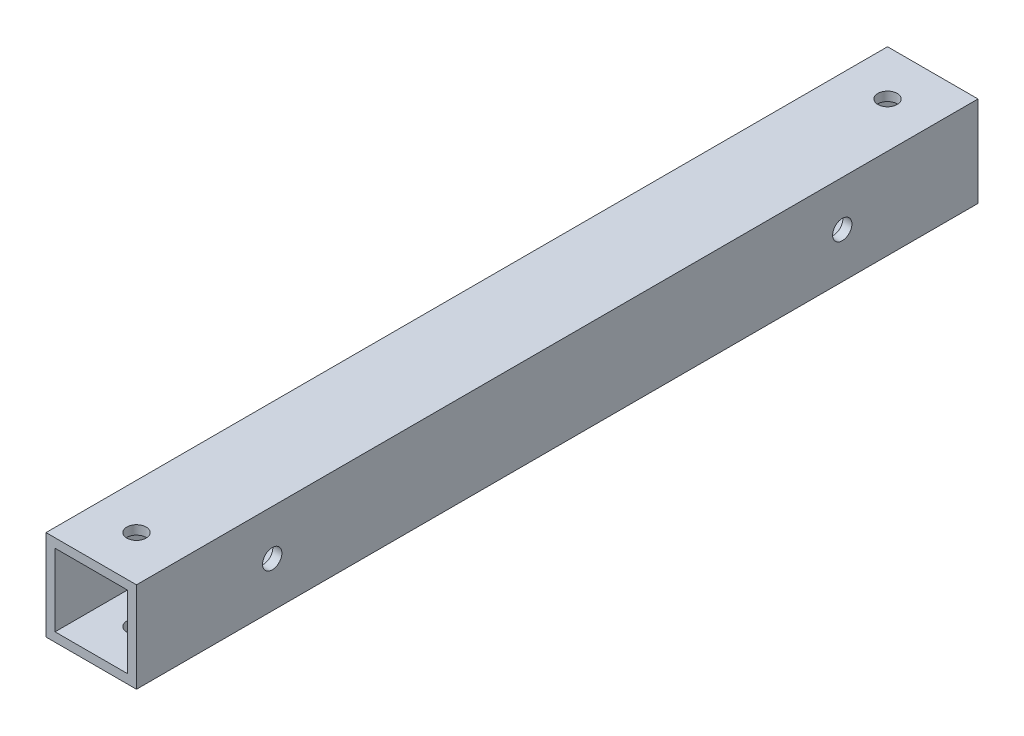
ISO-10303-21;
HEADER;
FILE_DESCRIPTION(('STEP AP214'),'2;1');
FILE_NAME('part.step','',(''),(''),'','','');
FILE_SCHEMA(('AUTOMOTIVE_DESIGN { 1 0 10303 214 1 1 1 1 }'));
ENDSEC;
DATA;
#1=APPLICATION_CONTEXT('core data for automotive mechanical design processes');
#2=APPLICATION_PROTOCOL_DEFINITION('international standard','automotive_design',2000,#1);
#3=PRODUCT_CONTEXT('',#1,'mechanical');
#4=PRODUCT('Part','Part','',(#3));
#5=PRODUCT_RELATED_PRODUCT_CATEGORY('part','',(#4));
#6=PRODUCT_DEFINITION_FORMATION('','',#4);
#7=PRODUCT_DEFINITION_CONTEXT('part definition',#1,'design');
#8=PRODUCT_DEFINITION('design','',#6,#7);
#9=PRODUCT_DEFINITION_SHAPE('','',#8);
#10=(LENGTH_UNIT() NAMED_UNIT(*) SI_UNIT(.MILLI.,.METRE.));
#11=(NAMED_UNIT(*) PLANE_ANGLE_UNIT() SI_UNIT($,.RADIAN.));
#12=(NAMED_UNIT(*) SI_UNIT($,.STERADIAN.) SOLID_ANGLE_UNIT());
#13=UNCERTAINTY_MEASURE_WITH_UNIT(LENGTH_MEASURE(1.E-05),#10,'distance_accuracy_value','');
#14=(GEOMETRIC_REPRESENTATION_CONTEXT(3) GLOBAL_UNCERTAINTY_ASSIGNED_CONTEXT((#13)) GLOBAL_UNIT_ASSIGNED_CONTEXT((#10,
#11,#12)) REPRESENTATION_CONTEXT('',''));
#15=CARTESIAN_POINT('',(0.,0.,0.));
#16=DIRECTION('',(0.,0.,1.));
#17=DIRECTION('',(1.,0.,0.));
#18=AXIS2_PLACEMENT_3D('',#15,#16,#17);
#19=CARTESIAN_POINT('',(0.,0.,139.5));
#20=DIRECTION('',(0.,0.,-1.));
#21=DIRECTION('',(-1.,0.,0.));
#22=AXIS2_PLACEMENT_3D('',#19,#20,#21);
#23=PLANE('',#22);
#24=DIRECTION('',(0.,1.,0.));
#25=VECTOR('',#24,1.);
#26=CARTESIAN_POINT('',(7.5,-7.5,139.5));
#27=LINE('',#26,#25);
#28=CARTESIAN_POINT('',(7.5,-7.5,139.5));
#29=VERTEX_POINT('',#28);
#30=CARTESIAN_POINT('',(7.5,7.5,139.5));
#31=VERTEX_POINT('',#30);
#32=EDGE_CURVE('E157',#29,#31,#27,.T.);
#33=ORIENTED_EDGE('',*,*,#32,.T.);
#34=DIRECTION('',(-1.,0.,0.));
#35=VECTOR('',#34,1.);
#36=CARTESIAN_POINT('',(-7.5,7.5,139.5));
#37=LINE('',#36,#35);
#38=CARTESIAN_POINT('',(-7.5,7.5,139.5));
#39=VERTEX_POINT('',#38);
#40=EDGE_CURVE('E161',#31,#39,#37,.T.);
#41=ORIENTED_EDGE('',*,*,#40,.T.);
#42=DIRECTION('',(0.,-1.,0.));
#43=VECTOR('',#42,1.);
#44=CARTESIAN_POINT('',(-7.5,-7.5,139.5));
#45=LINE('',#44,#43);
#46=CARTESIAN_POINT('',(-7.5,-7.5,139.5));
#47=VERTEX_POINT('',#46);
#48=EDGE_CURVE('E165',#39,#47,#45,.T.);
#49=ORIENTED_EDGE('',*,*,#48,.T.);
#50=DIRECTION('',(1.,0.,0.));
#51=VECTOR('',#50,1.);
#52=CARTESIAN_POINT('',(-7.5,-7.5,139.5));
#53=LINE('',#52,#51);
#54=EDGE_CURVE('E168',#47,#29,#53,.T.);
#55=ORIENTED_EDGE('',*,*,#54,.T.);
#56=EDGE_LOOP('',(#33,#41,#49,#55));
#57=FACE_BOUND('',#56,.T.);
#58=DIRECTION('',(0.,-1.,0.));
#59=VECTOR('',#58,1.);
#60=CARTESIAN_POINT('',(-6.,-6.,139.5));
#61=LINE('',#60,#59);
#62=CARTESIAN_POINT('',(-6.,6.,139.5));
#63=VERTEX_POINT('',#62);
#64=CARTESIAN_POINT('',(-6.,-6.,139.5));
#65=VERTEX_POINT('',#64);
#66=EDGE_CURVE('E107',#63,#65,#61,.T.);
#67=ORIENTED_EDGE('',*,*,#66,.F.);
#68=DIRECTION('',(-1.,0.,0.));
#69=VECTOR('',#68,1.);
#70=CARTESIAN_POINT('',(-6.,6.,139.5));
#71=LINE('',#70,#69);
#72=CARTESIAN_POINT('',(6.,6.,139.5));
#73=VERTEX_POINT('',#72);
#74=EDGE_CURVE('E133',#73,#63,#71,.T.);
#75=ORIENTED_EDGE('',*,*,#74,.F.);
#76=DIRECTION('',(0.,1.,0.));
#77=VECTOR('',#76,1.);
#78=CARTESIAN_POINT('',(6.,-6.,139.5));
#79=LINE('',#78,#77);
#80=CARTESIAN_POINT('',(6.,-6.,139.5));
#81=VERTEX_POINT('',#80);
#82=EDGE_CURVE('E129',#81,#73,#79,.T.);
#83=ORIENTED_EDGE('',*,*,#82,.F.);
#84=DIRECTION('',(1.,0.,0.));
#85=VECTOR('',#84,1.);
#86=CARTESIAN_POINT('',(-6.,-6.,139.5));
#87=LINE('',#86,#85);
#88=EDGE_CURVE('E116',#65,#81,#87,.T.);
#89=ORIENTED_EDGE('',*,*,#88,.F.);
#90=EDGE_LOOP('',(#67,#75,#83,#89));
#91=FACE_BOUND('',#90,.T.);
#92=ADVANCED_FACE('F39',(#57,#91),#23,.F.);
#93=CARTESIAN_POINT('',(0.,0.,0.));
#94=DIRECTION('',(0.,0.,-1.));
#95=DIRECTION('',(-1.,0.,0.));
#96=AXIS2_PLACEMENT_3D('',#93,#94,#95);
#97=PLANE('',#96);
#98=DIRECTION('',(0.,1.,0.));
#99=VECTOR('',#98,1.);
#100=CARTESIAN_POINT('',(7.5,-7.5,0.));
#101=LINE('',#100,#99);
#102=CARTESIAN_POINT('',(7.5,-7.5,0.));
#103=VERTEX_POINT('',#102);
#104=CARTESIAN_POINT('',(7.5,7.5,0.));
#105=VERTEX_POINT('',#104);
#106=EDGE_CURVE('E125',#103,#105,#101,.T.);
#107=ORIENTED_EDGE('',*,*,#106,.F.);
#108=DIRECTION('',(1.,0.,0.));
#109=VECTOR('',#108,1.);
#110=CARTESIAN_POINT('',(-7.5,-7.5,0.));
#111=LINE('',#110,#109);
#112=CARTESIAN_POINT('',(-7.5,-7.5,0.));
#113=VERTEX_POINT('',#112);
#114=EDGE_CURVE('E162',#113,#103,#111,.T.);
#115=ORIENTED_EDGE('',*,*,#114,.F.);
#116=DIRECTION('',(0.,-1.,0.));
#117=VECTOR('',#116,1.);
#118=CARTESIAN_POINT('',(-7.5,-7.5,0.));
#119=LINE('',#118,#117);
#120=CARTESIAN_POINT('',(-7.5,7.5,0.));
#121=VERTEX_POINT('',#120);
#122=EDGE_CURVE('E178',#121,#113,#119,.T.);
#123=ORIENTED_EDGE('',*,*,#122,.F.);
#124=DIRECTION('',(-1.,0.,0.));
#125=VECTOR('',#124,1.);
#126=CARTESIAN_POINT('',(-7.5,7.5,0.));
#127=LINE('',#126,#125);
#128=EDGE_CURVE('E175',#105,#121,#127,.T.);
#129=ORIENTED_EDGE('',*,*,#128,.F.);
#130=EDGE_LOOP('',(#107,#115,#123,#129));
#131=FACE_BOUND('',#130,.T.);
#132=DIRECTION('',(-1.,0.,0.));
#133=VECTOR('',#132,1.);
#134=CARTESIAN_POINT('',(-6.,6.,0.));
#135=LINE('',#134,#133);
#136=CARTESIAN_POINT('',(6.,6.,0.));
#137=VERTEX_POINT('',#136);
#138=CARTESIAN_POINT('',(-6.,6.,0.));
#139=VERTEX_POINT('',#138);
#140=EDGE_CURVE('E117',#137,#139,#135,.T.);
#141=ORIENTED_EDGE('',*,*,#140,.T.);
#142=DIRECTION('',(0.,-1.,0.));
#143=VECTOR('',#142,1.);
#144=CARTESIAN_POINT('',(-6.,-6.,0.));
#145=LINE('',#144,#143);
#146=CARTESIAN_POINT('',(-6.,-6.,0.));
#147=VERTEX_POINT('',#146);
#148=EDGE_CURVE('E65',#139,#147,#145,.T.);
#149=ORIENTED_EDGE('',*,*,#148,.T.);
#150=DIRECTION('',(1.,0.,0.));
#151=VECTOR('',#150,1.);
#152=CARTESIAN_POINT('',(-6.,-6.,0.));
#153=LINE('',#152,#151);
#154=CARTESIAN_POINT('',(6.,-6.,0.));
#155=VERTEX_POINT('',#154);
#156=EDGE_CURVE('E123',#147,#155,#153,.T.);
#157=ORIENTED_EDGE('',*,*,#156,.T.);
#158=DIRECTION('',(0.,1.,0.));
#159=VECTOR('',#158,1.);
#160=CARTESIAN_POINT('',(6.,-6.,0.));
#161=LINE('',#160,#159);
#162=EDGE_CURVE('E144',#155,#137,#161,.T.);
#163=ORIENTED_EDGE('',*,*,#162,.T.);
#164=EDGE_LOOP('',(#141,#149,#157,#163));
#165=FACE_BOUND('',#164,.T.);
#166=ADVANCED_FACE('F288',(#131,#165),#97,.T.);
#167=CARTESIAN_POINT('',(7.5,-7.5,139.5));
#168=DIRECTION('',(-1.,0.,0.));
#169=DIRECTION('',(0.,0.,1.));
#170=AXIS2_PLACEMENT_3D('',#167,#168,#169);
#171=PLANE('',#170);
#172=CARTESIAN_POINT('',(7.5,0.,117.));
#173=DIRECTION('',(1.,0.,0.));
#174=DIRECTION('',(0.,0.,-1.));
#175=AXIS2_PLACEMENT_3D('',#172,#173,#174);
#176=CIRCLE('',#175,1.60000000000002);
#177=CARTESIAN_POINT('',(7.5,0.,115.4));
#178=VERTEX_POINT('',#177);
#179=EDGE_CURVE('E214',#178,#178,#176,.T.);
#180=ORIENTED_EDGE('',*,*,#179,.F.);
#181=EDGE_LOOP('',(#180));
#182=FACE_BOUND('',#181,.T.);
#183=CARTESIAN_POINT('',(7.5,0.,22.5));
#184=DIRECTION('',(1.,0.,0.));
#185=DIRECTION('',(0.,0.,-1.));
#186=AXIS2_PLACEMENT_3D('',#183,#184,#185);
#187=CIRCLE('',#186,1.6);
#188=CARTESIAN_POINT('',(7.5,0.,20.9));
#189=VERTEX_POINT('',#188);
#190=EDGE_CURVE('E226',#189,#189,#187,.T.);
#191=ORIENTED_EDGE('',*,*,#190,.F.);
#192=EDGE_LOOP('',(#191));
#193=FACE_BOUND('',#192,.T.);
#194=ORIENTED_EDGE('',*,*,#106,.T.);
#195=DIRECTION('',(0.,0.,-1.));
#196=VECTOR('',#195,1.);
#197=CARTESIAN_POINT('',(7.5,7.5,139.5));
#198=LINE('',#197,#196);
#199=EDGE_CURVE('E11',#31,#105,#198,.T.);
#200=ORIENTED_EDGE('',*,*,#199,.F.);
#201=ORIENTED_EDGE('',*,*,#32,.F.);
#202=DIRECTION('',(0.,0.,-1.));
#203=VECTOR('',#202,1.);
#204=CARTESIAN_POINT('',(7.5,-7.5,139.5));
#205=LINE('',#204,#203);
#206=EDGE_CURVE('E171',#29,#103,#205,.T.);
#207=ORIENTED_EDGE('',*,*,#206,.T.);
#208=EDGE_LOOP('',(#194,#200,#201,#207));
#209=FACE_BOUND('',#208,.T.);
#210=ADVANCED_FACE('F41',(#182,#193,#209),#171,.F.);
#211=CARTESIAN_POINT('',(-7.5,7.5,139.5));
#212=DIRECTION('',(0.,-1.,0.));
#213=DIRECTION('',(0.,0.,-1.));
#214=AXIS2_PLACEMENT_3D('',#211,#212,#213);
#215=PLANE('',#214);
#216=CARTESIAN_POINT('',(0.,7.5,7.5));
#217=DIRECTION('',(0.,1.,0.));
#218=DIRECTION('',(0.,0.,1.));
#219=AXIS2_PLACEMENT_3D('',#216,#217,#218);
#220=CIRCLE('',#219,1.6);
#221=CARTESIAN_POINT('',(0.,7.5,9.1));
#222=VERTEX_POINT('',#221);
#223=EDGE_CURVE('E238',#222,#222,#220,.T.);
#224=ORIENTED_EDGE('',*,*,#223,.F.);
#225=EDGE_LOOP('',(#224));
#226=FACE_BOUND('',#225,.T.);
#227=CARTESIAN_POINT('',(0.,7.5,132.));
#228=DIRECTION('',(0.,1.,0.));
#229=DIRECTION('',(0.,0.,1.));
#230=AXIS2_PLACEMENT_3D('',#227,#228,#229);
#231=CIRCLE('',#230,1.59999999999999);
#232=CARTESIAN_POINT('',(0.,7.5,133.6));
#233=VERTEX_POINT('',#232);
#234=EDGE_CURVE('E234',#233,#233,#231,.T.);
#235=ORIENTED_EDGE('',*,*,#234,.F.);
#236=EDGE_LOOP('',(#235));
#237=FACE_BOUND('',#236,.T.);
#238=ORIENTED_EDGE('',*,*,#128,.T.);
#239=DIRECTION('',(0.,0.,-1.));
#240=VECTOR('',#239,1.);
#241=CARTESIAN_POINT('',(-7.5,7.5,139.5));
#242=LINE('',#241,#240);
#243=EDGE_CURVE('E49',#39,#121,#242,.T.);
#244=ORIENTED_EDGE('',*,*,#243,.F.);
#245=ORIENTED_EDGE('',*,*,#40,.F.);
#246=ORIENTED_EDGE('',*,*,#199,.T.);
#247=EDGE_LOOP('',(#238,#244,#245,#246));
#248=FACE_BOUND('',#247,.T.);
#249=ADVANCED_FACE('F292',(#226,#237,#248),#215,.F.);
#250=CARTESIAN_POINT('',(-7.5,-7.5,139.5));
#251=DIRECTION('',(1.,0.,0.));
#252=DIRECTION('',(0.,0.,-1.));
#253=AXIS2_PLACEMENT_3D('',#250,#251,#252);
#254=PLANE('',#253);
#255=CARTESIAN_POINT('',(-7.5,0.,117.));
#256=DIRECTION('',(1.,0.,0.));
#257=DIRECTION('',(0.,0.,-1.));
#258=AXIS2_PLACEMENT_3D('',#255,#256,#257);
#259=CIRCLE('',#258,1.60000000000002);
#260=CARTESIAN_POINT('',(-7.5,0.,115.4));
#261=VERTEX_POINT('',#260);
#262=EDGE_CURVE('E206',#261,#261,#259,.T.);
#263=ORIENTED_EDGE('',*,*,#262,.T.);
#264=EDGE_LOOP('',(#263));
#265=FACE_BOUND('',#264,.T.);
#266=CARTESIAN_POINT('',(-7.5,0.,22.5));
#267=DIRECTION('',(1.,0.,0.));
#268=DIRECTION('',(0.,0.,-1.));
#269=AXIS2_PLACEMENT_3D('',#266,#267,#268);
#270=CIRCLE('',#269,1.6);
#271=CARTESIAN_POINT('',(-7.5,0.,20.9));
#272=VERTEX_POINT('',#271);
#273=EDGE_CURVE('E220',#272,#272,#270,.T.);
#274=ORIENTED_EDGE('',*,*,#273,.T.);
#275=EDGE_LOOP('',(#274));
#276=FACE_BOUND('',#275,.T.);
#277=ORIENTED_EDGE('',*,*,#122,.T.);
#278=DIRECTION('',(0.,0.,-1.));
#279=VECTOR('',#278,1.);
#280=CARTESIAN_POINT('',(-7.5,-7.5,139.5));
#281=LINE('',#280,#279);
#282=EDGE_CURVE('E186',#47,#113,#281,.T.);
#283=ORIENTED_EDGE('',*,*,#282,.F.);
#284=ORIENTED_EDGE('',*,*,#48,.F.);
#285=ORIENTED_EDGE('',*,*,#243,.T.);
#286=EDGE_LOOP('',(#277,#283,#284,#285));
#287=FACE_BOUND('',#286,.T.);
#288=ADVANCED_FACE('F275',(#265,#276,#287),#254,.F.);
#289=CARTESIAN_POINT('',(-7.5,-7.5,139.5));
#290=DIRECTION('',(0.,1.,0.));
#291=DIRECTION('',(0.,0.,1.));
#292=AXIS2_PLACEMENT_3D('',#289,#290,#291);
#293=PLANE('',#292);
#294=CARTESIAN_POINT('',(0.,-7.5,7.5));
#295=DIRECTION('',(0.,1.,0.));
#296=DIRECTION('',(0.,0.,1.));
#297=AXIS2_PLACEMENT_3D('',#294,#295,#296);
#298=CIRCLE('',#297,1.6);
#299=CARTESIAN_POINT('',(0.,-7.5,9.1));
#300=VERTEX_POINT('',#299);
#301=EDGE_CURVE('E198',#300,#300,#298,.T.);
#302=ORIENTED_EDGE('',*,*,#301,.T.);
#303=EDGE_LOOP('',(#302));
#304=FACE_BOUND('',#303,.T.);
#305=CARTESIAN_POINT('',(0.,-7.5,132.));
#306=DIRECTION('',(0.,1.,0.));
#307=DIRECTION('',(0.,0.,1.));
#308=AXIS2_PLACEMENT_3D('',#305,#306,#307);
#309=CIRCLE('',#308,1.59999999999999);
#310=CARTESIAN_POINT('',(0.,-7.5,133.6));
#311=VERTEX_POINT('',#310);
#312=EDGE_CURVE('E242',#311,#311,#309,.T.);
#313=ORIENTED_EDGE('',*,*,#312,.T.);
#314=EDGE_LOOP('',(#313));
#315=FACE_BOUND('',#314,.T.);
#316=ORIENTED_EDGE('',*,*,#114,.T.);
#317=ORIENTED_EDGE('',*,*,#206,.F.);
#318=ORIENTED_EDGE('',*,*,#54,.F.);
#319=ORIENTED_EDGE('',*,*,#282,.T.);
#320=EDGE_LOOP('',(#316,#317,#318,#319));
#321=FACE_BOUND('',#320,.T.);
#322=ADVANCED_FACE('F272',(#304,#315,#321),#293,.F.);
#323=CARTESIAN_POINT('',(-6.,-6.,139.5));
#324=DIRECTION('',(1.,0.,0.));
#325=DIRECTION('',(0.,0.,-1.));
#326=AXIS2_PLACEMENT_3D('',#323,#324,#325);
#327=PLANE('',#326);
#328=CARTESIAN_POINT('',(-6.,0.,117.));
#329=DIRECTION('',(1.,0.,0.));
#330=DIRECTION('',(0.,0.,-1.));
#331=AXIS2_PLACEMENT_3D('',#328,#329,#330);
#332=CIRCLE('',#331,1.60000000000002);
#333=CARTESIAN_POINT('',(-6.,0.,115.4));
#334=VERTEX_POINT('',#333);
#335=EDGE_CURVE('E230',#334,#334,#332,.T.);
#336=ORIENTED_EDGE('',*,*,#335,.F.);
#337=EDGE_LOOP('',(#336));
#338=FACE_BOUND('',#337,.T.);
#339=CARTESIAN_POINT('',(-6.,0.,22.5));
#340=DIRECTION('',(1.,0.,0.));
#341=DIRECTION('',(0.,0.,-1.));
#342=AXIS2_PLACEMENT_3D('',#339,#340,#341);
#343=CIRCLE('',#342,1.6);
#344=CARTESIAN_POINT('',(-6.,0.,20.9));
#345=VERTEX_POINT('',#344);
#346=EDGE_CURVE('E205',#345,#345,#343,.T.);
#347=ORIENTED_EDGE('',*,*,#346,.F.);
#348=EDGE_LOOP('',(#347));
#349=FACE_BOUND('',#348,.T.);
#350=ORIENTED_EDGE('',*,*,#148,.F.);
#351=DIRECTION('',(0.,0.,-1.));
#352=VECTOR('',#351,1.);
#353=CARTESIAN_POINT('',(-6.,6.,139.5));
#354=LINE('',#353,#352);
#355=EDGE_CURVE('E111',#63,#139,#354,.T.);
#356=ORIENTED_EDGE('',*,*,#355,.F.);
#357=ORIENTED_EDGE('',*,*,#66,.T.);
#358=DIRECTION('',(0.,0.,-1.));
#359=VECTOR('',#358,1.);
#360=CARTESIAN_POINT('',(-6.,-6.,139.5));
#361=LINE('',#360,#359);
#362=EDGE_CURVE('E110',#65,#147,#361,.T.);
#363=ORIENTED_EDGE('',*,*,#362,.T.);
#364=EDGE_LOOP('',(#350,#356,#357,#363));
#365=FACE_BOUND('',#364,.T.);
#366=ADVANCED_FACE('F109',(#338,#349,#365),#327,.T.);
#367=CARTESIAN_POINT('',(-6.,-6.,139.5));
#368=DIRECTION('',(0.,1.,0.));
#369=DIRECTION('',(0.,0.,1.));
#370=AXIS2_PLACEMENT_3D('',#367,#368,#369);
#371=PLANE('',#370);
#372=CARTESIAN_POINT('',(0.,-6.,7.5));
#373=DIRECTION('',(0.,1.,0.));
#374=DIRECTION('',(0.,0.,1.));
#375=AXIS2_PLACEMENT_3D('',#372,#373,#374);
#376=CIRCLE('',#375,1.6);
#377=CARTESIAN_POINT('',(0.,-6.,9.1));
#378=VERTEX_POINT('',#377);
#379=EDGE_CURVE('E141',#378,#378,#376,.T.);
#380=ORIENTED_EDGE('',*,*,#379,.F.);
#381=EDGE_LOOP('',(#380));
#382=FACE_BOUND('',#381,.T.);
#383=CARTESIAN_POINT('',(0.,-6.,132.));
#384=DIRECTION('',(0.,1.,0.));
#385=DIRECTION('',(0.,0.,1.));
#386=AXIS2_PLACEMENT_3D('',#383,#384,#385);
#387=CIRCLE('',#386,1.59999999999999);
#388=CARTESIAN_POINT('',(0.,-6.,133.6));
#389=VERTEX_POINT('',#388);
#390=EDGE_CURVE('E197',#389,#389,#387,.T.);
#391=ORIENTED_EDGE('',*,*,#390,.F.);
#392=EDGE_LOOP('',(#391));
#393=FACE_BOUND('',#392,.T.);
#394=ORIENTED_EDGE('',*,*,#156,.F.);
#395=ORIENTED_EDGE('',*,*,#362,.F.);
#396=ORIENTED_EDGE('',*,*,#88,.T.);
#397=DIRECTION('',(0.,0.,-1.));
#398=VECTOR('',#397,1.);
#399=CARTESIAN_POINT('',(6.,-6.,139.5));
#400=LINE('',#399,#398);
#401=EDGE_CURVE('E126',#81,#155,#400,.T.);
#402=ORIENTED_EDGE('',*,*,#401,.T.);
#403=EDGE_LOOP('',(#394,#395,#396,#402));
#404=FACE_BOUND('',#403,.T.);
#405=ADVANCED_FACE('F120',(#382,#393,#404),#371,.T.);
#406=CARTESIAN_POINT('',(6.,-6.,139.5));
#407=DIRECTION('',(-1.,0.,0.));
#408=DIRECTION('',(0.,-1.,0.));
#409=AXIS2_PLACEMENT_3D('',#406,#407,#408);
#410=PLANE('',#409);
#411=CARTESIAN_POINT('',(6.,0.,117.));
#412=DIRECTION('',(-1.,0.,0.));
#413=DIRECTION('',(0.,-1.,0.));
#414=AXIS2_PLACEMENT_3D('',#411,#412,#413);
#415=CIRCLE('',#414,1.60000000000002);
#416=CARTESIAN_POINT('',(6.,0.,115.4));
#417=VERTEX_POINT('',#416);
#418=EDGE_CURVE('E43',#417,#417,#415,.T.);
#419=ORIENTED_EDGE('',*,*,#418,.F.);
#420=EDGE_LOOP('',(#419));
#421=FACE_BOUND('',#420,.T.);
#422=CARTESIAN_POINT('',(6.,0.,22.5));
#423=DIRECTION('',(-1.,0.,0.));
#424=DIRECTION('',(0.,-1.,0.));
#425=AXIS2_PLACEMENT_3D('',#422,#423,#424);
#426=CIRCLE('',#425,1.6);
#427=CARTESIAN_POINT('',(6.,0.,20.9));
#428=VERTEX_POINT('',#427);
#429=EDGE_CURVE('E202',#428,#428,#426,.T.);
#430=ORIENTED_EDGE('',*,*,#429,.F.);
#431=EDGE_LOOP('',(#430));
#432=FACE_BOUND('',#431,.T.);
#433=ORIENTED_EDGE('',*,*,#162,.F.);
#434=ORIENTED_EDGE('',*,*,#401,.F.);
#435=ORIENTED_EDGE('',*,*,#82,.T.);
#436=DIRECTION('',(0.,0.,-1.));
#437=VECTOR('',#436,1.);
#438=CARTESIAN_POINT('',(6.,6.,139.5));
#439=LINE('',#438,#437);
#440=EDGE_CURVE('E57',#73,#137,#439,.T.);
#441=ORIENTED_EDGE('',*,*,#440,.T.);
#442=EDGE_LOOP('',(#433,#434,#435,#441));
#443=FACE_BOUND('',#442,.T.);
#444=ADVANCED_FACE('F260',(#421,#432,#443),#410,.T.);
#445=CARTESIAN_POINT('',(-6.,6.,139.5));
#446=DIRECTION('',(0.,-1.,0.));
#447=DIRECTION('',(1.,0.,0.));
#448=AXIS2_PLACEMENT_3D('',#445,#446,#447);
#449=PLANE('',#448);
#450=CARTESIAN_POINT('',(0.,6.,7.5));
#451=DIRECTION('',(0.,-1.,0.));
#452=DIRECTION('',(1.,0.,0.));
#453=AXIS2_PLACEMENT_3D('',#450,#451,#452);
#454=CIRCLE('',#453,1.6);
#455=CARTESIAN_POINT('',(1.6,6.,7.5));
#456=VERTEX_POINT('',#455);
#457=EDGE_CURVE('E199',#456,#456,#454,.T.);
#458=ORIENTED_EDGE('',*,*,#457,.F.);
#459=EDGE_LOOP('',(#458));
#460=FACE_BOUND('',#459,.T.);
#461=CARTESIAN_POINT('',(0.,6.,132.));
#462=DIRECTION('',(0.,-1.,0.));
#463=DIRECTION('',(1.,0.,0.));
#464=AXIS2_PLACEMENT_3D('',#461,#462,#463);
#465=CIRCLE('',#464,1.59999999999999);
#466=CARTESIAN_POINT('',(1.59999999999999,6.,132.));
#467=VERTEX_POINT('',#466);
#468=EDGE_CURVE('E193',#467,#467,#465,.T.);
#469=ORIENTED_EDGE('',*,*,#468,.F.);
#470=EDGE_LOOP('',(#469));
#471=FACE_BOUND('',#470,.T.);
#472=ORIENTED_EDGE('',*,*,#140,.F.);
#473=ORIENTED_EDGE('',*,*,#440,.F.);
#474=ORIENTED_EDGE('',*,*,#74,.T.);
#475=ORIENTED_EDGE('',*,*,#355,.T.);
#476=EDGE_LOOP('',(#472,#473,#474,#475));
#477=FACE_BOUND('',#476,.T.);
#478=ADVANCED_FACE('F315',(#460,#471,#477),#449,.T.);
#479=CARTESIAN_POINT('',(0.,-7.5,132.));
#480=DIRECTION('',(0.,1.,0.));
#481=DIRECTION('',(0.,0.,1.));
#482=AXIS2_PLACEMENT_3D('',#479,#480,#481);
#483=CYLINDRICAL_SURFACE('',#482,1.59999999999999);
#484=ORIENTED_EDGE('',*,*,#468,.T.);
#485=EDGE_LOOP('',(#484));
#486=FACE_BOUND('',#485,.T.);
#487=ORIENTED_EDGE('',*,*,#234,.T.);
#488=EDGE_LOOP('',(#487));
#489=FACE_BOUND('',#488,.T.);
#490=ADVANCED_FACE('F269',(#486,#489),#483,.F.);
#491=CARTESIAN_POINT('',(0.,-7.5,7.5));
#492=DIRECTION('',(0.,1.,0.));
#493=DIRECTION('',(0.,0.,1.));
#494=AXIS2_PLACEMENT_3D('',#491,#492,#493);
#495=CYLINDRICAL_SURFACE('',#494,1.6);
#496=ORIENTED_EDGE('',*,*,#457,.T.);
#497=EDGE_LOOP('',(#496));
#498=FACE_BOUND('',#497,.T.);
#499=ORIENTED_EDGE('',*,*,#223,.T.);
#500=EDGE_LOOP('',(#499));
#501=FACE_BOUND('',#500,.T.);
#502=ADVANCED_FACE('F267',(#498,#501),#495,.F.);
#503=ORIENTED_EDGE('',*,*,#390,.T.);
#504=EDGE_LOOP('',(#503));
#505=FACE_BOUND('',#504,.T.);
#506=ORIENTED_EDGE('',*,*,#312,.F.);
#507=EDGE_LOOP('',(#506));
#508=FACE_BOUND('',#507,.T.);
#509=ADVANCED_FACE('F264',(#505,#508),#483,.F.);
#510=ORIENTED_EDGE('',*,*,#379,.T.);
#511=EDGE_LOOP('',(#510));
#512=FACE_BOUND('',#511,.T.);
#513=ORIENTED_EDGE('',*,*,#301,.F.);
#514=EDGE_LOOP('',(#513));
#515=FACE_BOUND('',#514,.T.);
#516=ADVANCED_FACE('F255',(#512,#515),#495,.F.);
#517=CARTESIAN_POINT('',(-7.5,0.,22.5));
#518=DIRECTION('',(1.,0.,0.));
#519=DIRECTION('',(0.,0.,-1.));
#520=AXIS2_PLACEMENT_3D('',#517,#518,#519);
#521=CYLINDRICAL_SURFACE('',#520,1.6);
#522=CARTESIAN_POINT('',(6.,0.,20.9));
#523=CARTESIAN_POINT('',(6.015625,0.,20.9));
#524=CARTESIAN_POINT('',(6.03125,0.,20.9));
#525=CARTESIAN_POINT('',(6.0625,0.,20.9));
#526=CARTESIAN_POINT('',(6.078125,0.,20.9));
#527=CARTESIAN_POINT('',(6.109375,0.,20.9));
#528=CARTESIAN_POINT('',(6.125,0.,20.9));
#529=CARTESIAN_POINT('',(6.15625,0.,20.9));
#530=CARTESIAN_POINT('',(6.171875,0.,20.9));
#531=CARTESIAN_POINT('',(6.203125,0.,20.9));
#532=CARTESIAN_POINT('',(6.21875,0.,20.9));
#533=CARTESIAN_POINT('',(6.25,0.,20.9));
#534=CARTESIAN_POINT('',(6.265625,0.,20.9));
#535=CARTESIAN_POINT('',(6.296875,0.,20.9));
#536=CARTESIAN_POINT('',(6.3125,0.,20.9));
#537=CARTESIAN_POINT('',(6.34375,0.,20.9));
#538=CARTESIAN_POINT('',(6.359375,0.,20.9));
#539=CARTESIAN_POINT('',(6.390625,0.,20.9));
#540=CARTESIAN_POINT('',(6.40625,0.,20.9));
#541=CARTESIAN_POINT('',(6.4375,0.,20.9));
#542=CARTESIAN_POINT('',(6.453125,0.,20.9));
#543=CARTESIAN_POINT('',(6.484375,0.,20.9));
#544=CARTESIAN_POINT('',(6.5,0.,20.9));
#545=CARTESIAN_POINT('',(6.53125,0.,20.9));
#546=CARTESIAN_POINT('',(6.546875,0.,20.9));
#547=CARTESIAN_POINT('',(6.578125,0.,20.9));
#548=CARTESIAN_POINT('',(6.59375,0.,20.9));
#549=CARTESIAN_POINT('',(6.625,0.,20.9));
#550=CARTESIAN_POINT('',(6.640625,0.,20.9));
#551=CARTESIAN_POINT('',(6.671875,0.,20.9));
#552=CARTESIAN_POINT('',(6.6875,0.,20.9));
#553=CARTESIAN_POINT('',(6.71875,0.,20.9));
#554=CARTESIAN_POINT('',(6.734375,0.,20.9));
#555=CARTESIAN_POINT('',(6.765625,0.,20.9));
#556=CARTESIAN_POINT('',(6.78125,0.,20.9));
#557=CARTESIAN_POINT('',(6.8125,0.,20.9));
#558=CARTESIAN_POINT('',(6.828125,0.,20.9));
#559=CARTESIAN_POINT('',(6.859375,0.,20.9));
#560=CARTESIAN_POINT('',(6.875,0.,20.9));
#561=CARTESIAN_POINT('',(6.90625,0.,20.9));
#562=CARTESIAN_POINT('',(6.921875,0.,20.9));
#563=CARTESIAN_POINT('',(6.953125,0.,20.9));
#564=CARTESIAN_POINT('',(6.96875,0.,20.9));
#565=CARTESIAN_POINT('',(7.,0.,20.9));
#566=CARTESIAN_POINT('',(7.015625,0.,20.9));
#567=CARTESIAN_POINT('',(7.046875,0.,20.9));
#568=CARTESIAN_POINT('',(7.0625,0.,20.9));
#569=CARTESIAN_POINT('',(7.09375,0.,20.9));
#570=CARTESIAN_POINT('',(7.109375,0.,20.9));
#571=CARTESIAN_POINT('',(7.140625,0.,20.9));
#572=CARTESIAN_POINT('',(7.15625,0.,20.9));
#573=CARTESIAN_POINT('',(7.1875,0.,20.9));
#574=CARTESIAN_POINT('',(7.203125,0.,20.9));
#575=CARTESIAN_POINT('',(7.234375,0.,20.9));
#576=CARTESIAN_POINT('',(7.25,0.,20.9));
#577=CARTESIAN_POINT('',(7.28125,0.,20.9));
#578=CARTESIAN_POINT('',(7.296875,0.,20.9));
#579=CARTESIAN_POINT('',(7.328125,0.,20.9));
#580=CARTESIAN_POINT('',(7.34375,0.,20.9));
#581=CARTESIAN_POINT('',(7.375,0.,20.9));
#582=CARTESIAN_POINT('',(7.390625,0.,20.9));
#583=CARTESIAN_POINT('',(7.421875,0.,20.9));
#584=CARTESIAN_POINT('',(7.4375,0.,20.9));
#585=CARTESIAN_POINT('',(7.46875,0.,20.9));
#586=CARTESIAN_POINT('',(7.484375,0.,20.9));
#587=CARTESIAN_POINT('',(7.5,0.,20.9));
#588=B_SPLINE_CURVE_WITH_KNOTS('',3,(#522,#523,#524,#525,#526,#527,#528,#529,#530,#531,#532,
#533,#534,#535,#536,#537,#538,#539,#540,#541,#542,#543,#544,#545,#546,#547,#548,#549,#550,#551,
#552,#553,#554,#555,#556,#557,#558,#559,#560,#561,#562,#563,#564,#565,#566,#567,#568,#569,#570,
#571,#572,#573,#574,#575,#576,#577,#578,#579,#580,#581,#582,#583,#584,#585,#586,#587),
.UNSPECIFIED.,.F.,.F.,(4,2,2,2,2,2,2,2,2,2,2,2,2,2,2,2,2,2,2,2,2,2,2,2,2,2,2,2,2,2,2,2,4),(0.,
0.046875,0.0937500000000001,0.140625,0.1875,0.234375,0.28125,0.328125,0.375,0.421874999999999,
0.468749999999999,0.515624999999999,0.562499999999999,0.609374999999999,0.656249999999999,
0.703124999999999,0.749999999999999,0.796874999999999,0.843749999999999,0.890624999999999,
0.937499999999999,0.984374999999999,1.03125,1.078125,1.125,1.171875,1.21875,1.265625,1.3125,
1.359375,1.40625,1.453125,1.5),.UNSPECIFIED.);
#589=EDGE_CURVE('BSEAM325',#428,#189,#588,.T.);
#590=ORIENTED_EDGE('',*,*,#429,.T.);
#591=ORIENTED_EDGE('',*,*,#190,.T.);
#592=ORIENTED_EDGE('',*,*,#589,.T.);
#593=ORIENTED_EDGE('',*,*,#589,.F.);
#594=EDGE_LOOP('',(#590,#592,#591,#593));
#595=FACE_BOUND('',#594,.T.);
#596=ADVANCED_FACE('F325',(#595),#521,.F.);
#597=CARTESIAN_POINT('',(-7.5,0.,117.));
#598=DIRECTION('',(1.,0.,0.));
#599=DIRECTION('',(0.,0.,-1.));
#600=AXIS2_PLACEMENT_3D('',#597,#598,#599);
#601=CYLINDRICAL_SURFACE('',#600,1.60000000000002);
#602=CARTESIAN_POINT('',(6.,0.,115.4));
#603=CARTESIAN_POINT('',(6.015625,0.,115.4));
#604=CARTESIAN_POINT('',(6.03125,0.,115.4));
#605=CARTESIAN_POINT('',(6.0625,0.,115.4));
#606=CARTESIAN_POINT('',(6.078125,0.,115.4));
#607=CARTESIAN_POINT('',(6.109375,0.,115.4));
#608=CARTESIAN_POINT('',(6.125,0.,115.4));
#609=CARTESIAN_POINT('',(6.15625,0.,115.4));
#610=CARTESIAN_POINT('',(6.171875,0.,115.4));
#611=CARTESIAN_POINT('',(6.203125,0.,115.4));
#612=CARTESIAN_POINT('',(6.21875,0.,115.4));
#613=CARTESIAN_POINT('',(6.25,0.,115.4));
#614=CARTESIAN_POINT('',(6.265625,0.,115.4));
#615=CARTESIAN_POINT('',(6.296875,0.,115.4));
#616=CARTESIAN_POINT('',(6.3125,0.,115.4));
#617=CARTESIAN_POINT('',(6.34375,0.,115.4));
#618=CARTESIAN_POINT('',(6.359375,0.,115.4));
#619=CARTESIAN_POINT('',(6.390625,0.,115.4));
#620=CARTESIAN_POINT('',(6.40625,0.,115.4));
#621=CARTESIAN_POINT('',(6.4375,0.,115.4));
#622=CARTESIAN_POINT('',(6.453125,0.,115.4));
#623=CARTESIAN_POINT('',(6.484375,0.,115.4));
#624=CARTESIAN_POINT('',(6.5,0.,115.4));
#625=CARTESIAN_POINT('',(6.53125,0.,115.4));
#626=CARTESIAN_POINT('',(6.546875,0.,115.4));
#627=CARTESIAN_POINT('',(6.578125,0.,115.4));
#628=CARTESIAN_POINT('',(6.59375,0.,115.4));
#629=CARTESIAN_POINT('',(6.625,0.,115.4));
#630=CARTESIAN_POINT('',(6.640625,0.,115.4));
#631=CARTESIAN_POINT('',(6.671875,0.,115.4));
#632=CARTESIAN_POINT('',(6.6875,0.,115.4));
#633=CARTESIAN_POINT('',(6.71875,0.,115.4));
#634=CARTESIAN_POINT('',(6.734375,0.,115.4));
#635=CARTESIAN_POINT('',(6.765625,0.,115.4));
#636=CARTESIAN_POINT('',(6.78125,0.,115.4));
#637=CARTESIAN_POINT('',(6.8125,0.,115.4));
#638=CARTESIAN_POINT('',(6.828125,0.,115.4));
#639=CARTESIAN_POINT('',(6.859375,0.,115.4));
#640=CARTESIAN_POINT('',(6.875,0.,115.4));
#641=CARTESIAN_POINT('',(6.90625,0.,115.4));
#642=CARTESIAN_POINT('',(6.921875,0.,115.4));
#643=CARTESIAN_POINT('',(6.953125,0.,115.4));
#644=CARTESIAN_POINT('',(6.96875,0.,115.4));
#645=CARTESIAN_POINT('',(7.,0.,115.4));
#646=CARTESIAN_POINT('',(7.015625,0.,115.4));
#647=CARTESIAN_POINT('',(7.046875,0.,115.4));
#648=CARTESIAN_POINT('',(7.0625,0.,115.4));
#649=CARTESIAN_POINT('',(7.09375,0.,115.4));
#650=CARTESIAN_POINT('',(7.109375,0.,115.4));
#651=CARTESIAN_POINT('',(7.140625,0.,115.4));
#652=CARTESIAN_POINT('',(7.15625,0.,115.4));
#653=CARTESIAN_POINT('',(7.1875,0.,115.4));
#654=CARTESIAN_POINT('',(7.203125,0.,115.4));
#655=CARTESIAN_POINT('',(7.234375,0.,115.4));
#656=CARTESIAN_POINT('',(7.25,0.,115.4));
#657=CARTESIAN_POINT('',(7.28125,0.,115.4));
#658=CARTESIAN_POINT('',(7.296875,0.,115.4));
#659=CARTESIAN_POINT('',(7.328125,0.,115.4));
#660=CARTESIAN_POINT('',(7.34375,0.,115.4));
#661=CARTESIAN_POINT('',(7.375,0.,115.4));
#662=CARTESIAN_POINT('',(7.390625,0.,115.4));
#663=CARTESIAN_POINT('',(7.421875,0.,115.4));
#664=CARTESIAN_POINT('',(7.4375,0.,115.4));
#665=CARTESIAN_POINT('',(7.46875,0.,115.4));
#666=CARTESIAN_POINT('',(7.484375,0.,115.4));
#667=CARTESIAN_POINT('',(7.5,0.,115.4));
#668=B_SPLINE_CURVE_WITH_KNOTS('',3,(#602,#603,#604,#605,#606,#607,#608,#609,#610,#611,#612,
#613,#614,#615,#616,#617,#618,#619,#620,#621,#622,#623,#624,#625,#626,#627,#628,#629,#630,#631,
#632,#633,#634,#635,#636,#637,#638,#639,#640,#641,#642,#643,#644,#645,#646,#647,#648,#649,#650,
#651,#652,#653,#654,#655,#656,#657,#658,#659,#660,#661,#662,#663,#664,#665,#666,#667),
.UNSPECIFIED.,.F.,.F.,(4,2,2,2,2,2,2,2,2,2,2,2,2,2,2,2,2,2,2,2,2,2,2,2,2,2,2,2,2,2,2,2,4),(0.,
0.046875,0.0937500000000001,0.140625,0.1875,0.234375,0.28125,0.328125,0.375,0.421874999999999,
0.468749999999999,0.515624999999999,0.562499999999999,0.609374999999999,0.656249999999999,
0.703124999999999,0.749999999999999,0.796874999999999,0.843749999999999,0.890624999999999,
0.937499999999999,0.984374999999999,1.03125,1.078125,1.125,1.171875,1.21875,1.265625,1.3125,
1.359375,1.40625,1.453125,1.5),.UNSPECIFIED.);
#669=EDGE_CURVE('BSEAM328',#417,#178,#668,.T.);
#670=ORIENTED_EDGE('',*,*,#418,.T.);
#671=ORIENTED_EDGE('',*,*,#179,.T.);
#672=ORIENTED_EDGE('',*,*,#669,.T.);
#673=ORIENTED_EDGE('',*,*,#669,.F.);
#674=EDGE_LOOP('',(#670,#672,#671,#673));
#675=FACE_BOUND('',#674,.T.);
#676=ADVANCED_FACE('F328',(#675),#601,.F.);
#677=CARTESIAN_POINT('',(-6.,0.,20.9));
#678=CARTESIAN_POINT('',(-6.015625,0.,20.9));
#679=CARTESIAN_POINT('',(-6.03125,0.,20.9));
#680=CARTESIAN_POINT('',(-6.0625,0.,20.9));
#681=CARTESIAN_POINT('',(-6.078125,0.,20.9));
#682=CARTESIAN_POINT('',(-6.109375,0.,20.9));
#683=CARTESIAN_POINT('',(-6.125,0.,20.9));
#684=CARTESIAN_POINT('',(-6.15625,0.,20.9));
#685=CARTESIAN_POINT('',(-6.171875,0.,20.9));
#686=CARTESIAN_POINT('',(-6.203125,0.,20.9));
#687=CARTESIAN_POINT('',(-6.21875,0.,20.9));
#688=CARTESIAN_POINT('',(-6.25,0.,20.9));
#689=CARTESIAN_POINT('',(-6.265625,0.,20.9));
#690=CARTESIAN_POINT('',(-6.296875,0.,20.9));
#691=CARTESIAN_POINT('',(-6.3125,0.,20.9));
#692=CARTESIAN_POINT('',(-6.34375,0.,20.9));
#693=CARTESIAN_POINT('',(-6.359375,0.,20.9));
#694=CARTESIAN_POINT('',(-6.390625,0.,20.9));
#695=CARTESIAN_POINT('',(-6.40625,0.,20.9));
#696=CARTESIAN_POINT('',(-6.4375,0.,20.9));
#697=CARTESIAN_POINT('',(-6.453125,0.,20.9));
#698=CARTESIAN_POINT('',(-6.484375,0.,20.9));
#699=CARTESIAN_POINT('',(-6.5,0.,20.9));
#700=CARTESIAN_POINT('',(-6.53125,0.,20.9));
#701=CARTESIAN_POINT('',(-6.546875,0.,20.9));
#702=CARTESIAN_POINT('',(-6.578125,0.,20.9));
#703=CARTESIAN_POINT('',(-6.59375,0.,20.9));
#704=CARTESIAN_POINT('',(-6.625,0.,20.9));
#705=CARTESIAN_POINT('',(-6.640625,0.,20.9));
#706=CARTESIAN_POINT('',(-6.671875,0.,20.9));
#707=CARTESIAN_POINT('',(-6.6875,0.,20.9));
#708=CARTESIAN_POINT('',(-6.71875,0.,20.9));
#709=CARTESIAN_POINT('',(-6.734375,0.,20.9));
#710=CARTESIAN_POINT('',(-6.765625,0.,20.9));
#711=CARTESIAN_POINT('',(-6.78125,0.,20.9));
#712=CARTESIAN_POINT('',(-6.8125,0.,20.9));
#713=CARTESIAN_POINT('',(-6.828125,0.,20.9));
#714=CARTESIAN_POINT('',(-6.859375,0.,20.9));
#715=CARTESIAN_POINT('',(-6.875,0.,20.9));
#716=CARTESIAN_POINT('',(-6.90625,0.,20.9));
#717=CARTESIAN_POINT('',(-6.921875,0.,20.9));
#718=CARTESIAN_POINT('',(-6.953125,0.,20.9));
#719=CARTESIAN_POINT('',(-6.96875,0.,20.9));
#720=CARTESIAN_POINT('',(-7.,0.,20.9));
#721=CARTESIAN_POINT('',(-7.015625,0.,20.9));
#722=CARTESIAN_POINT('',(-7.046875,0.,20.9));
#723=CARTESIAN_POINT('',(-7.0625,0.,20.9));
#724=CARTESIAN_POINT('',(-7.09375,0.,20.9));
#725=CARTESIAN_POINT('',(-7.109375,0.,20.9));
#726=CARTESIAN_POINT('',(-7.140625,0.,20.9));
#727=CARTESIAN_POINT('',(-7.15625,0.,20.9));
#728=CARTESIAN_POINT('',(-7.1875,0.,20.9));
#729=CARTESIAN_POINT('',(-7.203125,0.,20.9));
#730=CARTESIAN_POINT('',(-7.234375,0.,20.9));
#731=CARTESIAN_POINT('',(-7.25,0.,20.9));
#732=CARTESIAN_POINT('',(-7.28125,0.,20.9));
#733=CARTESIAN_POINT('',(-7.296875,0.,20.9));
#734=CARTESIAN_POINT('',(-7.328125,0.,20.9));
#735=CARTESIAN_POINT('',(-7.34375,0.,20.9));
#736=CARTESIAN_POINT('',(-7.375,0.,20.9));
#737=CARTESIAN_POINT('',(-7.390625,0.,20.9));
#738=CARTESIAN_POINT('',(-7.421875,0.,20.9));
#739=CARTESIAN_POINT('',(-7.4375,0.,20.9));
#740=CARTESIAN_POINT('',(-7.46875,0.,20.9));
#741=CARTESIAN_POINT('',(-7.484375,0.,20.9));
#742=CARTESIAN_POINT('',(-7.5,0.,20.9));
#743=B_SPLINE_CURVE_WITH_KNOTS('',3,(#677,#678,#679,#680,#681,#682,#683,#684,#685,#686,#687,
#688,#689,#690,#691,#692,#693,#694,#695,#696,#697,#698,#699,#700,#701,#702,#703,#704,#705,#706,
#707,#708,#709,#710,#711,#712,#713,#714,#715,#716,#717,#718,#719,#720,#721,#722,#723,#724,#725,
#726,#727,#728,#729,#730,#731,#732,#733,#734,#735,#736,#737,#738,#739,#740,#741,#742),
.UNSPECIFIED.,.F.,.F.,(4,2,2,2,2,2,2,2,2,2,2,2,2,2,2,2,2,2,2,2,2,2,2,2,2,2,2,2,2,2,2,2,4),(0.,
0.046875,0.0937500000000001,0.140625,0.1875,0.234374999999999,0.281249999999999,
0.328124999999999,0.374999999999999,0.421875,0.46875,0.515625,0.5625,0.609375,0.65625,0.703125,
0.75,0.796875,0.84375,0.890625,0.9375,0.984375,1.03125,1.078125,1.125,1.171875,1.21875,1.265625,
1.3125,1.359375,1.40625,1.453125,1.5),.UNSPECIFIED.);
#744=EDGE_CURVE('BSEAM329',#345,#272,#743,.T.);
#745=ORIENTED_EDGE('',*,*,#346,.T.);
#746=ORIENTED_EDGE('',*,*,#273,.F.);
#747=ORIENTED_EDGE('',*,*,#744,.T.);
#748=ORIENTED_EDGE('',*,*,#744,.F.);
#749=EDGE_LOOP('',(#745,#747,#746,#748));
#750=FACE_BOUND('',#749,.T.);
#751=ADVANCED_FACE('F329',(#750),#521,.F.);
#752=CARTESIAN_POINT('',(-6.,0.,115.4));
#753=CARTESIAN_POINT('',(-6.015625,0.,115.4));
#754=CARTESIAN_POINT('',(-6.03125,0.,115.4));
#755=CARTESIAN_POINT('',(-6.0625,0.,115.4));
#756=CARTESIAN_POINT('',(-6.078125,0.,115.4));
#757=CARTESIAN_POINT('',(-6.109375,0.,115.4));
#758=CARTESIAN_POINT('',(-6.125,0.,115.4));
#759=CARTESIAN_POINT('',(-6.15625,0.,115.4));
#760=CARTESIAN_POINT('',(-6.171875,0.,115.4));
#761=CARTESIAN_POINT('',(-6.203125,0.,115.4));
#762=CARTESIAN_POINT('',(-6.21875,0.,115.4));
#763=CARTESIAN_POINT('',(-6.25,0.,115.4));
#764=CARTESIAN_POINT('',(-6.265625,0.,115.4));
#765=CARTESIAN_POINT('',(-6.296875,0.,115.4));
#766=CARTESIAN_POINT('',(-6.3125,0.,115.4));
#767=CARTESIAN_POINT('',(-6.34375,0.,115.4));
#768=CARTESIAN_POINT('',(-6.359375,0.,115.4));
#769=CARTESIAN_POINT('',(-6.390625,0.,115.4));
#770=CARTESIAN_POINT('',(-6.40625,0.,115.4));
#771=CARTESIAN_POINT('',(-6.4375,0.,115.4));
#772=CARTESIAN_POINT('',(-6.453125,0.,115.4));
#773=CARTESIAN_POINT('',(-6.484375,0.,115.4));
#774=CARTESIAN_POINT('',(-6.5,0.,115.4));
#775=CARTESIAN_POINT('',(-6.53125,0.,115.4));
#776=CARTESIAN_POINT('',(-6.546875,0.,115.4));
#777=CARTESIAN_POINT('',(-6.578125,0.,115.4));
#778=CARTESIAN_POINT('',(-6.59375,0.,115.4));
#779=CARTESIAN_POINT('',(-6.625,0.,115.4));
#780=CARTESIAN_POINT('',(-6.640625,0.,115.4));
#781=CARTESIAN_POINT('',(-6.671875,0.,115.4));
#782=CARTESIAN_POINT('',(-6.6875,0.,115.4));
#783=CARTESIAN_POINT('',(-6.71875,0.,115.4));
#784=CARTESIAN_POINT('',(-6.734375,0.,115.4));
#785=CARTESIAN_POINT('',(-6.765625,0.,115.4));
#786=CARTESIAN_POINT('',(-6.78125,0.,115.4));
#787=CARTESIAN_POINT('',(-6.8125,0.,115.4));
#788=CARTESIAN_POINT('',(-6.828125,0.,115.4));
#789=CARTESIAN_POINT('',(-6.859375,0.,115.4));
#790=CARTESIAN_POINT('',(-6.875,0.,115.4));
#791=CARTESIAN_POINT('',(-6.90625,0.,115.4));
#792=CARTESIAN_POINT('',(-6.921875,0.,115.4));
#793=CARTESIAN_POINT('',(-6.953125,0.,115.4));
#794=CARTESIAN_POINT('',(-6.96875,0.,115.4));
#795=CARTESIAN_POINT('',(-7.,0.,115.4));
#796=CARTESIAN_POINT('',(-7.015625,0.,115.4));
#797=CARTESIAN_POINT('',(-7.046875,0.,115.4));
#798=CARTESIAN_POINT('',(-7.0625,0.,115.4));
#799=CARTESIAN_POINT('',(-7.09375,0.,115.4));
#800=CARTESIAN_POINT('',(-7.109375,0.,115.4));
#801=CARTESIAN_POINT('',(-7.140625,0.,115.4));
#802=CARTESIAN_POINT('',(-7.15625,0.,115.4));
#803=CARTESIAN_POINT('',(-7.1875,0.,115.4));
#804=CARTESIAN_POINT('',(-7.203125,0.,115.4));
#805=CARTESIAN_POINT('',(-7.234375,0.,115.4));
#806=CARTESIAN_POINT('',(-7.25,0.,115.4));
#807=CARTESIAN_POINT('',(-7.28125,0.,115.4));
#808=CARTESIAN_POINT('',(-7.296875,0.,115.4));
#809=CARTESIAN_POINT('',(-7.328125,0.,115.4));
#810=CARTESIAN_POINT('',(-7.34375,0.,115.4));
#811=CARTESIAN_POINT('',(-7.375,0.,115.4));
#812=CARTESIAN_POINT('',(-7.390625,0.,115.4));
#813=CARTESIAN_POINT('',(-7.421875,0.,115.4));
#814=CARTESIAN_POINT('',(-7.4375,0.,115.4));
#815=CARTESIAN_POINT('',(-7.46875,0.,115.4));
#816=CARTESIAN_POINT('',(-7.484375,0.,115.4));
#817=CARTESIAN_POINT('',(-7.5,0.,115.4));
#818=B_SPLINE_CURVE_WITH_KNOTS('',3,(#752,#753,#754,#755,#756,#757,#758,#759,#760,#761,#762,
#763,#764,#765,#766,#767,#768,#769,#770,#771,#772,#773,#774,#775,#776,#777,#778,#779,#780,#781,
#782,#783,#784,#785,#786,#787,#788,#789,#790,#791,#792,#793,#794,#795,#796,#797,#798,#799,#800,
#801,#802,#803,#804,#805,#806,#807,#808,#809,#810,#811,#812,#813,#814,#815,#816,#817),
.UNSPECIFIED.,.F.,.F.,(4,2,2,2,2,2,2,2,2,2,2,2,2,2,2,2,2,2,2,2,2,2,2,2,2,2,2,2,2,2,2,2,4),(0.,
0.046875,0.0937500000000001,0.140625,0.1875,0.234374999999999,0.281249999999999,
0.328124999999999,0.374999999999999,0.421875,0.46875,0.515625,0.5625,0.609375,0.65625,0.703125,
0.75,0.796875,0.84375,0.890625,0.9375,0.984375,1.03125,1.078125,1.125,1.171875,1.21875,1.265625,
1.3125,1.359375,1.40625,1.453125,1.5),.UNSPECIFIED.);
#819=EDGE_CURVE('BSEAM332',#334,#261,#818,.T.);
#820=ORIENTED_EDGE('',*,*,#335,.T.);
#821=ORIENTED_EDGE('',*,*,#262,.F.);
#822=ORIENTED_EDGE('',*,*,#819,.T.);
#823=ORIENTED_EDGE('',*,*,#819,.F.);
#824=EDGE_LOOP('',(#820,#822,#821,#823));
#825=FACE_BOUND('',#824,.T.);
#826=ADVANCED_FACE('F332',(#825),#601,.F.);
#827=CLOSED_SHELL('',(#92,#166,#210,#249,#288,#322,#366,#405,#444,#478,#490,#502,#509,#516,#596,
#676,#751,#826));
#828=MANIFOLD_SOLID_BREP('B2',#827);
#829=ADVANCED_BREP_SHAPE_REPRESENTATION('',(#18,#828),#14);
#830=SHAPE_DEFINITION_REPRESENTATION(#9,#829);
ENDSEC;
END-ISO-10303-21;
